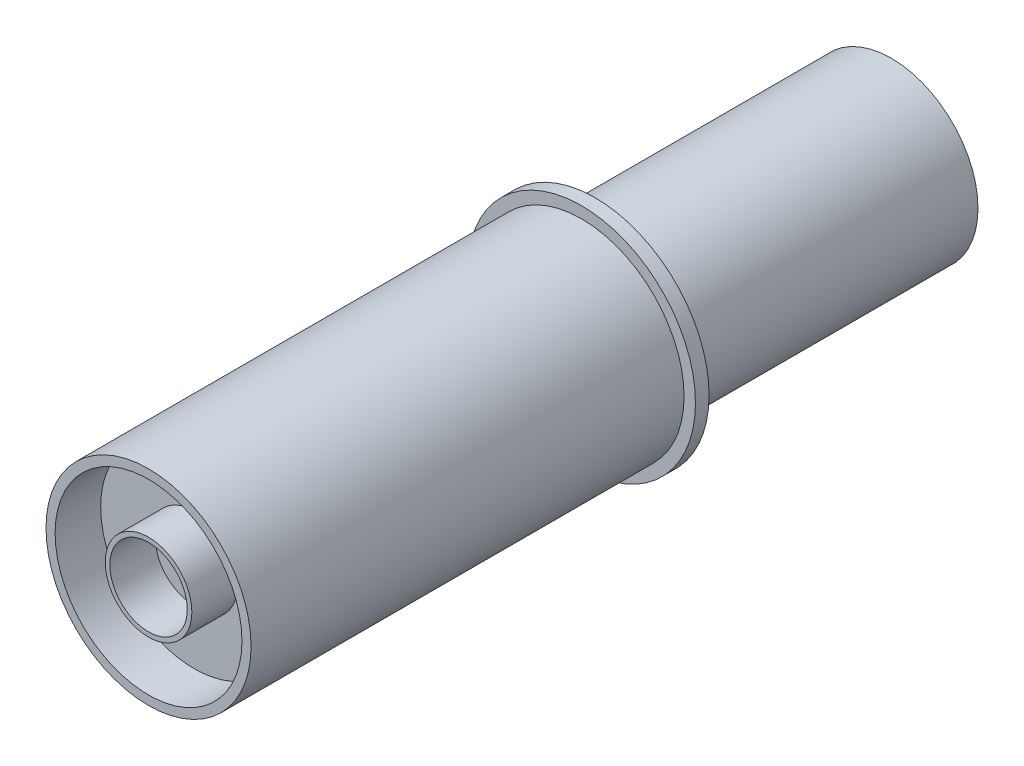
ISO-10303-21;
HEADER;
FILE_DESCRIPTION(('STEP AP214'),'2;1');
FILE_NAME('part.step','',(''),(''),'','','');
FILE_SCHEMA(('AUTOMOTIVE_DESIGN { 1 0 10303 214 1 1 1 1 }'));
ENDSEC;
DATA;
#1=APPLICATION_CONTEXT('core data for automotive mechanical design processes');
#2=APPLICATION_PROTOCOL_DEFINITION('international standard','automotive_design',2000,#1);
#3=PRODUCT_CONTEXT('',#1,'mechanical');
#4=PRODUCT('Part','Part','',(#3));
#5=PRODUCT_RELATED_PRODUCT_CATEGORY('part','',(#4));
#6=PRODUCT_DEFINITION_FORMATION('','',#4);
#7=PRODUCT_DEFINITION_CONTEXT('part definition',#1,'design');
#8=PRODUCT_DEFINITION('design','',#6,#7);
#9=PRODUCT_DEFINITION_SHAPE('','',#8);
#10=(LENGTH_UNIT() NAMED_UNIT(*) SI_UNIT(.MILLI.,.METRE.));
#11=(NAMED_UNIT(*) PLANE_ANGLE_UNIT() SI_UNIT($,.RADIAN.));
#12=(NAMED_UNIT(*) SI_UNIT($,.STERADIAN.) SOLID_ANGLE_UNIT());
#13=UNCERTAINTY_MEASURE_WITH_UNIT(LENGTH_MEASURE(1.E-05),#10,'distance_accuracy_value','');
#14=(GEOMETRIC_REPRESENTATION_CONTEXT(3) GLOBAL_UNCERTAINTY_ASSIGNED_CONTEXT((#13)) GLOBAL_UNIT_ASSIGNED_CONTEXT((#10,
#11,#12)) REPRESENTATION_CONTEXT('',''));
#15=CARTESIAN_POINT('',(0.,0.,0.));
#16=DIRECTION('',(0.,0.,1.));
#17=DIRECTION('',(1.,0.,0.));
#18=AXIS2_PLACEMENT_3D('',#15,#16,#17);
#19=CARTESIAN_POINT('',(-114.166758923899,45.6667035695596,65.));
#20=DIRECTION('',(0.,0.,-1.));
#21=DIRECTION('',(-1.,0.,0.));
#22=AXIS2_PLACEMENT_3D('',#19,#20,#21);
#23=CYLINDRICAL_SURFACE('',#22,19.);
#24=CARTESIAN_POINT('',(-114.166758923899,45.6667035695596,65.));
#25=DIRECTION('',(0.,0.,1.));
#26=DIRECTION('',(1.,0.,0.));
#27=AXIS2_PLACEMENT_3D('',#24,#25,#26);
#28=CIRCLE('',#27,19.);
#29=CARTESIAN_POINT('',(-95.166758923899,45.6667035695596,65.));
#30=VERTEX_POINT('',#29);
#31=EDGE_CURVE('E53',#30,#30,#28,.T.);
#32=ORIENTED_EDGE('',*,*,#31,.F.);
#33=EDGE_LOOP('',(#32));
#34=FACE_BOUND('',#33,.T.);
#35=CARTESIAN_POINT('',(-114.166758923899,45.6667035695596,0.));
#36=DIRECTION('',(0.,0.,1.));
#37=DIRECTION('',(1.,0.,0.));
#38=AXIS2_PLACEMENT_3D('',#35,#36,#37);
#39=CIRCLE('',#38,19.);
#40=CARTESIAN_POINT('',(-95.166758923899,45.6667035695596,0.));
#41=VERTEX_POINT('',#40);
#42=EDGE_CURVE('E59',#41,#41,#39,.T.);
#43=ORIENTED_EDGE('',*,*,#42,.T.);
#44=EDGE_LOOP('',(#43));
#45=FACE_BOUND('',#44,.T.);
#46=ADVANCED_FACE('F41',(#34,#45),#23,.T.);
#47=CARTESIAN_POINT('',(-114.166758923899,45.6667035695596,0.));
#48=DIRECTION('',(0.,0.,1.));
#49=DIRECTION('',(1.,0.,0.));
#50=AXIS2_PLACEMENT_3D('',#47,#48,#49);
#51=PLANE('',#50);
#52=ORIENTED_EDGE('',*,*,#42,.F.);
#53=EDGE_LOOP('',(#52));
#54=FACE_BOUND('',#53,.T.);
#55=ADVANCED_FACE('F77',(#54),#51,.F.);
#56=CARTESIAN_POINT('',(-114.166758923899,45.6667035695596,68.));
#57=DIRECTION('',(0.,0.,-1.));
#58=DIRECTION('',(-1.,0.,0.));
#59=AXIS2_PLACEMENT_3D('',#56,#57,#58);
#60=CYLINDRICAL_SURFACE('',#59,25.);
#61=CARTESIAN_POINT('',(-114.166758923899,45.6667035695596,68.));
#62=DIRECTION('',(0.,0.,1.));
#63=DIRECTION('',(1.,0.,0.));
#64=AXIS2_PLACEMENT_3D('',#61,#62,#63);
#65=CIRCLE('',#64,25.);
#66=CARTESIAN_POINT('',(-89.166758923899,45.6667035695596,68.));
#67=VERTEX_POINT('',#66);
#68=EDGE_CURVE('E65',#67,#67,#65,.T.);
#69=ORIENTED_EDGE('',*,*,#68,.F.);
#70=EDGE_LOOP('',(#69));
#71=FACE_BOUND('',#70,.T.);
#72=CARTESIAN_POINT('',(-114.166758923899,45.6667035695596,65.));
#73=DIRECTION('',(0.,0.,1.));
#74=DIRECTION('',(1.,0.,0.));
#75=AXIS2_PLACEMENT_3D('',#72,#73,#74);
#76=CIRCLE('',#75,25.);
#77=CARTESIAN_POINT('',(-89.166758923899,45.6667035695596,65.));
#78=VERTEX_POINT('',#77);
#79=EDGE_CURVE('E69',#78,#78,#76,.T.);
#80=ORIENTED_EDGE('',*,*,#79,.T.);
#81=EDGE_LOOP('',(#80));
#82=FACE_BOUND('',#81,.T.);
#83=ADVANCED_FACE('F79',(#71,#82),#60,.T.);
#84=CARTESIAN_POINT('',(-114.166758923899,45.6667035695596,68.));
#85=DIRECTION('',(0.,0.,1.));
#86=DIRECTION('',(1.,0.,0.));
#87=AXIS2_PLACEMENT_3D('',#84,#85,#86);
#88=PLANE('',#87);
#89=CARTESIAN_POINT('',(-114.166758923899,45.6667035695596,68.));
#90=DIRECTION('',(0.,0.,1.));
#91=DIRECTION('',(1.,0.,0.));
#92=AXIS2_PLACEMENT_3D('',#89,#90,#91);
#93=CIRCLE('',#92,22.5);
#94=CARTESIAN_POINT('',(-91.666758923899,45.6667035695596,68.));
#95=VERTEX_POINT('',#94);
#96=EDGE_CURVE('E48',#95,#95,#93,.T.);
#97=ORIENTED_EDGE('',*,*,#96,.F.);
#98=EDGE_LOOP('',(#97));
#99=FACE_BOUND('',#98,.T.);
#100=ORIENTED_EDGE('',*,*,#68,.T.);
#101=EDGE_LOOP('',(#100));
#102=FACE_BOUND('',#101,.T.);
#103=ADVANCED_FACE('F84',(#99,#102),#88,.T.);
#104=CARTESIAN_POINT('',(-114.166758923899,45.6667035695596,65.));
#105=DIRECTION('',(0.,0.,1.));
#106=DIRECTION('',(1.,0.,0.));
#107=AXIS2_PLACEMENT_3D('',#104,#105,#106);
#108=PLANE('',#107);
#109=ORIENTED_EDGE('',*,*,#31,.T.);
#110=EDGE_LOOP('',(#109));
#111=FACE_BOUND('',#110,.T.);
#112=ORIENTED_EDGE('',*,*,#79,.F.);
#113=EDGE_LOOP('',(#112));
#114=FACE_BOUND('',#113,.T.);
#115=ADVANCED_FACE('F89',(#111,#114),#108,.F.);
#116=CARTESIAN_POINT('',(-114.166758923899,45.6667035695596,163.));
#117=DIRECTION('',(0.,0.,-1.));
#118=DIRECTION('',(-1.,0.,0.));
#119=AXIS2_PLACEMENT_3D('',#116,#117,#118);
#120=CYLINDRICAL_SURFACE('',#119,22.5);
#121=CARTESIAN_POINT('',(-114.166758923899,45.6667035695596,163.));
#122=DIRECTION('',(0.,0.,1.));
#123=DIRECTION('',(1.,0.,0.));
#124=AXIS2_PLACEMENT_3D('',#121,#122,#123);
#125=CIRCLE('',#124,22.5);
#126=CARTESIAN_POINT('',(-91.666758923899,45.6667035695596,163.));
#127=VERTEX_POINT('',#126);
#128=EDGE_CURVE('E63',#127,#127,#125,.T.);
#129=ORIENTED_EDGE('',*,*,#128,.F.);
#130=EDGE_LOOP('',(#129));
#131=FACE_BOUND('',#130,.T.);
#132=ORIENTED_EDGE('',*,*,#96,.T.);
#133=EDGE_LOOP('',(#132));
#134=FACE_BOUND('',#133,.T.);
#135=ADVANCED_FACE('F92',(#131,#134),#120,.T.);
#136=CARTESIAN_POINT('',(-114.166758923899,45.6667035695596,163.));
#137=DIRECTION('',(0.,0.,1.));
#138=DIRECTION('',(1.,0.,0.));
#139=AXIS2_PLACEMENT_3D('',#136,#137,#138);
#140=PLANE('',#139);
#141=CARTESIAN_POINT('',(-114.166758923899,45.6667035695596,163.));
#142=DIRECTION('',(0.,0.,1.));
#143=DIRECTION('',(1.,0.,0.));
#144=AXIS2_PLACEMENT_3D('',#141,#142,#143);
#145=CIRCLE('',#144,20.5);
#146=CARTESIAN_POINT('',(-93.666758923899,45.6667035695596,163.));
#147=VERTEX_POINT('',#146);
#148=EDGE_CURVE('E142',#147,#147,#145,.T.);
#149=ORIENTED_EDGE('',*,*,#148,.F.);
#150=EDGE_LOOP('',(#149));
#151=FACE_BOUND('',#150,.T.);
#152=ORIENTED_EDGE('',*,*,#128,.T.);
#153=EDGE_LOOP('',(#152));
#154=FACE_BOUND('',#153,.T.);
#155=ADVANCED_FACE('F99',(#151,#154),#140,.T.);
#156=CARTESIAN_POINT('',(-114.166758923899,45.6667035695596,153.));
#157=DIRECTION('',(0.,0.,1.));
#158=DIRECTION('',(1.,0.,0.));
#159=AXIS2_PLACEMENT_3D('',#156,#157,#158);
#160=CYLINDRICAL_SURFACE('',#159,20.5);
#161=CARTESIAN_POINT('',(-114.166758923899,45.6667035695596,153.));
#162=DIRECTION('',(0.,0.,1.));
#163=DIRECTION('',(1.,0.,0.));
#164=AXIS2_PLACEMENT_3D('',#161,#162,#163);
#165=CIRCLE('',#164,20.5);
#166=CARTESIAN_POINT('',(-93.666758923899,45.6667035695596,153.));
#167=VERTEX_POINT('',#166);
#168=EDGE_CURVE('E144',#167,#167,#165,.T.);
#169=ORIENTED_EDGE('',*,*,#168,.F.);
#170=EDGE_LOOP('',(#169));
#171=FACE_BOUND('',#170,.T.);
#172=ORIENTED_EDGE('',*,*,#148,.T.);
#173=EDGE_LOOP('',(#172));
#174=FACE_BOUND('',#173,.T.);
#175=ADVANCED_FACE('F103',(#171,#174),#160,.F.);
#176=CARTESIAN_POINT('',(-114.166758923899,45.6667035695596,153.));
#177=DIRECTION('',(0.,0.,1.));
#178=DIRECTION('',(1.,0.,0.));
#179=AXIS2_PLACEMENT_3D('',#176,#177,#178);
#180=PLANE('',#179);
#181=CARTESIAN_POINT('',(-114.166758923899,45.6667035695596,153.));
#182=DIRECTION('',(0.,0.,1.));
#183=DIRECTION('',(1.,0.,0.));
#184=AXIS2_PLACEMENT_3D('',#181,#182,#183);
#185=CIRCLE('',#184,9.5);
#186=CARTESIAN_POINT('',(-104.666758923899,45.6667035695596,153.));
#187=VERTEX_POINT('',#186);
#188=EDGE_CURVE('E133',#187,#187,#185,.T.);
#189=ORIENTED_EDGE('',*,*,#188,.F.);
#190=EDGE_LOOP('',(#189));
#191=FACE_BOUND('',#190,.T.);
#192=ORIENTED_EDGE('',*,*,#168,.T.);
#193=EDGE_LOOP('',(#192));
#194=FACE_BOUND('',#193,.T.);
#195=ADVANCED_FACE('F107',(#191,#194),#180,.T.);
#196=CARTESIAN_POINT('',(-114.166758923899,45.6667035695596,163.));
#197=DIRECTION('',(0.,0.,1.));
#198=DIRECTION('',(1.,0.,0.));
#199=AXIS2_PLACEMENT_3D('',#196,#197,#198);
#200=PLANE('',#199);
#201=CARTESIAN_POINT('',(-114.166758923899,45.6667035695596,163.));
#202=DIRECTION('',(0.,0.,1.));
#203=DIRECTION('',(1.,0.,0.));
#204=AXIS2_PLACEMENT_3D('',#201,#202,#203);
#205=CIRCLE('',#204,9.5);
#206=CARTESIAN_POINT('',(-104.666758923899,45.6667035695596,163.));
#207=VERTEX_POINT('',#206);
#208=EDGE_CURVE('E137',#207,#207,#205,.T.);
#209=ORIENTED_EDGE('',*,*,#208,.T.);
#210=EDGE_LOOP('',(#209));
#211=FACE_BOUND('',#210,.T.);
#212=CARTESIAN_POINT('',(-114.166758923899,45.6667035695596,163.));
#213=DIRECTION('',(0.,0.,1.));
#214=DIRECTION('',(1.,0.,0.));
#215=AXIS2_PLACEMENT_3D('',#212,#213,#214);
#216=CIRCLE('',#215,8.5);
#217=CARTESIAN_POINT('',(-105.666758923899,45.6667035695596,163.));
#218=VERTEX_POINT('',#217);
#219=EDGE_CURVE('E130',#218,#218,#216,.T.);
#220=ORIENTED_EDGE('',*,*,#219,.F.);
#221=EDGE_LOOP('',(#220));
#222=FACE_BOUND('',#221,.T.);
#223=ADVANCED_FACE('F111',(#211,#222),#200,.T.);
#224=CARTESIAN_POINT('',(-114.166758923899,45.6667035695596,163.));
#225=DIRECTION('',(0.,0.,-1.));
#226=DIRECTION('',(-1.,0.,0.));
#227=AXIS2_PLACEMENT_3D('',#224,#225,#226);
#228=CYLINDRICAL_SURFACE('',#227,9.5);
#229=ORIENTED_EDGE('',*,*,#208,.F.);
#230=EDGE_LOOP('',(#229));
#231=FACE_BOUND('',#230,.T.);
#232=ORIENTED_EDGE('',*,*,#188,.T.);
#233=EDGE_LOOP('',(#232));
#234=FACE_BOUND('',#233,.T.);
#235=ADVANCED_FACE('F114',(#231,#234),#228,.T.);
#236=CARTESIAN_POINT('',(-114.166758923899,45.6667035695596,163.));
#237=DIRECTION('',(0.,0.,-1.));
#238=DIRECTION('',(-1.,0.,0.));
#239=AXIS2_PLACEMENT_3D('',#236,#237,#238);
#240=CYLINDRICAL_SURFACE('',#239,8.5);
#241=ORIENTED_EDGE('',*,*,#219,.T.);
#242=EDGE_LOOP('',(#241));
#243=FACE_BOUND('',#242,.T.);
#244=CARTESIAN_POINT('',(-114.166758923899,45.6667035695596,153.));
#245=DIRECTION('',(0.,0.,1.));
#246=DIRECTION('',(1.,0.,0.));
#247=AXIS2_PLACEMENT_3D('',#244,#245,#246);
#248=CIRCLE('',#247,8.5);
#249=CARTESIAN_POINT('',(-105.666758923899,45.6667035695596,153.));
#250=VERTEX_POINT('',#249);
#251=EDGE_CURVE('E10',#250,#250,#248,.F.);
#252=ORIENTED_EDGE('',*,*,#251,.T.);
#253=EDGE_LOOP('',(#252));
#254=FACE_BOUND('',#253,.T.);
#255=ADVANCED_FACE('F117',(#243,#254),#240,.F.);
#256=ORIENTED_EDGE('',*,*,#251,.F.);
#257=EDGE_LOOP('',(#256));
#258=FACE_BOUND('',#257,.T.);
#259=ADVANCED_FACE('F113',(#258),#180,.T.);
#260=CLOSED_SHELL('',(#46,#55,#83,#103,#115,#135,#155,#175,#195,#223,#235,#255,#259));
#261=MANIFOLD_SOLID_BREP('B2',#260);
#262=ADVANCED_BREP_SHAPE_REPRESENTATION('',(#18,#261),#14);
#263=SHAPE_DEFINITION_REPRESENTATION(#9,#262);
ENDSEC;
END-ISO-10303-21;
